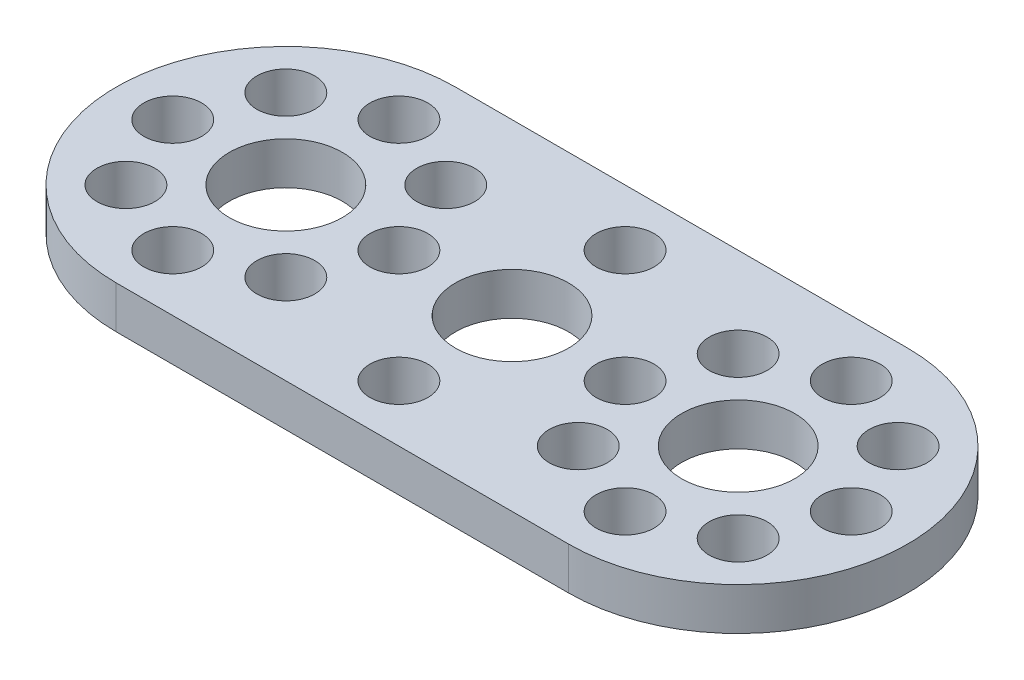
ISO-10303-21;
HEADER;
FILE_DESCRIPTION(('STEP AP214'),'2;1');
FILE_NAME('part.step','',(''),(''),'','','');
FILE_SCHEMA(('AUTOMOTIVE_DESIGN { 1 0 10303 214 1 1 1 1 }'));
ENDSEC;
DATA;
#1=APPLICATION_CONTEXT('core data for automotive mechanical design processes');
#2=APPLICATION_PROTOCOL_DEFINITION('international standard','automotive_design',2000,#1);
#3=PRODUCT_CONTEXT('',#1,'mechanical');
#4=PRODUCT('Part','Part','',(#3));
#5=PRODUCT_RELATED_PRODUCT_CATEGORY('part','',(#4));
#6=PRODUCT_DEFINITION_FORMATION('','',#4);
#7=PRODUCT_DEFINITION_CONTEXT('part definition',#1,'design');
#8=PRODUCT_DEFINITION('design','',#6,#7);
#9=PRODUCT_DEFINITION_SHAPE('','',#8);
#10=(LENGTH_UNIT() NAMED_UNIT(*) SI_UNIT(.MILLI.,.METRE.));
#11=(NAMED_UNIT(*) PLANE_ANGLE_UNIT() SI_UNIT($,.RADIAN.));
#12=(NAMED_UNIT(*) SI_UNIT($,.STERADIAN.) SOLID_ANGLE_UNIT());
#13=UNCERTAINTY_MEASURE_WITH_UNIT(LENGTH_MEASURE(1.E-05),#10,'distance_accuracy_value','');
#14=(GEOMETRIC_REPRESENTATION_CONTEXT(3) GLOBAL_UNCERTAINTY_ASSIGNED_CONTEXT((#13)) GLOBAL_UNIT_ASSIGNED_CONTEXT((#10,
#11,#12)) REPRESENTATION_CONTEXT('',''));
#15=CARTESIAN_POINT('',(0.,0.,0.));
#16=DIRECTION('',(0.,0.,1.));
#17=DIRECTION('',(1.,0.,0.));
#18=AXIS2_PLACEMENT_3D('',#15,#16,#17);
#19=CARTESIAN_POINT('',(0.,3.,0.));
#20=DIRECTION('',(0.,-1.,0.));
#21=DIRECTION('',(0.,0.,-1.));
#22=AXIS2_PLACEMENT_3D('',#19,#20,#21);
#23=CYLINDRICAL_SURFACE('',#22,12.);
#24=CARTESIAN_POINT('',(0.,0.,0.));
#25=DIRECTION('',(0.,1.,0.));
#26=DIRECTION('',(0.,0.,1.));
#27=AXIS2_PLACEMENT_3D('',#24,#25,#26);
#28=CIRCLE('',#27,12.);
#29=CARTESIAN_POINT('',(0.,0.,-12.));
#30=VERTEX_POINT('',#29);
#31=CARTESIAN_POINT('',(0.,0.,12.));
#32=VERTEX_POINT('',#31);
#33=EDGE_CURVE('E96',#30,#32,#28,.T.);
#34=ORIENTED_EDGE('',*,*,#33,.T.);
#35=DIRECTION('',(0.,-1.,0.));
#36=VECTOR('',#35,1.);
#37=CARTESIAN_POINT('',(0.,3.,12.));
#38=LINE('',#37,#36);
#39=CARTESIAN_POINT('',(0.,3.,12.));
#40=VERTEX_POINT('',#39);
#41=EDGE_CURVE('E11',#40,#32,#38,.T.);
#42=ORIENTED_EDGE('',*,*,#41,.F.);
#43=CARTESIAN_POINT('',(0.,3.,0.));
#44=DIRECTION('',(0.,1.,0.));
#45=DIRECTION('',(0.,0.,1.));
#46=AXIS2_PLACEMENT_3D('',#43,#44,#45);
#47=CIRCLE('',#46,12.);
#48=CARTESIAN_POINT('',(0.,3.,-12.));
#49=VERTEX_POINT('',#48);
#50=EDGE_CURVE('E84',#49,#40,#47,.T.);
#51=ORIENTED_EDGE('',*,*,#50,.F.);
#52=DIRECTION('',(0.,-1.,0.));
#53=VECTOR('',#52,1.);
#54=CARTESIAN_POINT('',(0.,3.,-12.));
#55=LINE('',#54,#53);
#56=EDGE_CURVE('E92',#49,#30,#55,.T.);
#57=ORIENTED_EDGE('',*,*,#56,.T.);
#58=EDGE_LOOP('',(#34,#42,#51,#57));
#59=FACE_BOUND('',#58,.T.);
#60=ADVANCED_FACE('F33',(#59),#23,.T.);
#61=CARTESIAN_POINT('',(0.,3.,12.));
#62=DIRECTION('',(0.,0.,-1.));
#63=DIRECTION('',(-1.,0.,0.));
#64=AXIS2_PLACEMENT_3D('',#61,#62,#63);
#65=PLANE('',#64);
#66=DIRECTION('',(1.,0.,0.));
#67=VECTOR('',#66,1.);
#68=CARTESIAN_POINT('',(0.,0.,12.));
#69=LINE('',#68,#67);
#70=CARTESIAN_POINT('',(32.,0.,12.));
#71=VERTEX_POINT('',#70);
#72=EDGE_CURVE('E88',#32,#71,#69,.T.);
#73=ORIENTED_EDGE('',*,*,#72,.T.);
#74=DIRECTION('',(0.,-1.,0.));
#75=VECTOR('',#74,1.);
#76=CARTESIAN_POINT('',(32.,3.,12.));
#77=LINE('',#76,#75);
#78=CARTESIAN_POINT('',(32.,3.,12.));
#79=VERTEX_POINT('',#78);
#80=EDGE_CURVE('E41',#79,#71,#77,.T.);
#81=ORIENTED_EDGE('',*,*,#80,.F.);
#82=DIRECTION('',(1.,0.,0.));
#83=VECTOR('',#82,1.);
#84=CARTESIAN_POINT('',(0.,3.,12.));
#85=LINE('',#84,#83);
#86=EDGE_CURVE('E79',#40,#79,#85,.T.);
#87=ORIENTED_EDGE('',*,*,#86,.F.);
#88=ORIENTED_EDGE('',*,*,#41,.T.);
#89=EDGE_LOOP('',(#73,#81,#87,#88));
#90=FACE_BOUND('',#89,.T.);
#91=ADVANCED_FACE('F87',(#90),#65,.F.);
#92=CARTESIAN_POINT('',(32.,3.,0.));
#93=DIRECTION('',(0.,-1.,0.));
#94=DIRECTION('',(0.,0.,-1.));
#95=AXIS2_PLACEMENT_3D('',#92,#93,#94);
#96=CYLINDRICAL_SURFACE('',#95,12.);
#97=CARTESIAN_POINT('',(32.,0.,0.));
#98=DIRECTION('',(0.,1.,0.));
#99=DIRECTION('',(0.,0.,1.));
#100=AXIS2_PLACEMENT_3D('',#97,#98,#99);
#101=CIRCLE('',#100,12.);
#102=CARTESIAN_POINT('',(32.,0.,-12.));
#103=VERTEX_POINT('',#102);
#104=EDGE_CURVE('E66',#71,#103,#101,.T.);
#105=ORIENTED_EDGE('',*,*,#104,.T.);
#106=DIRECTION('',(0.,-1.,0.));
#107=VECTOR('',#106,1.);
#108=CARTESIAN_POINT('',(32.,3.,-12.));
#109=LINE('',#108,#107);
#110=CARTESIAN_POINT('',(32.,3.,-12.));
#111=VERTEX_POINT('',#110);
#112=EDGE_CURVE('E89',#111,#103,#109,.T.);
#113=ORIENTED_EDGE('',*,*,#112,.F.);
#114=CARTESIAN_POINT('',(32.,3.,0.));
#115=DIRECTION('',(0.,1.,0.));
#116=DIRECTION('',(0.,0.,1.));
#117=AXIS2_PLACEMENT_3D('',#114,#115,#116);
#118=CIRCLE('',#117,12.);
#119=EDGE_CURVE('E82',#79,#111,#118,.T.);
#120=ORIENTED_EDGE('',*,*,#119,.F.);
#121=ORIENTED_EDGE('',*,*,#80,.T.);
#122=EDGE_LOOP('',(#105,#113,#120,#121));
#123=FACE_BOUND('',#122,.T.);
#124=ADVANCED_FACE('F90',(#123),#96,.T.);
#125=CARTESIAN_POINT('',(0.,3.,-12.));
#126=DIRECTION('',(0.,0.,1.));
#127=DIRECTION('',(1.,0.,0.));
#128=AXIS2_PLACEMENT_3D('',#125,#126,#127);
#129=PLANE('',#128);
#130=DIRECTION('',(-1.,0.,0.));
#131=VECTOR('',#130,1.);
#132=CARTESIAN_POINT('',(0.,0.,-12.));
#133=LINE('',#132,#131);
#134=EDGE_CURVE('E72',#103,#30,#133,.T.);
#135=ORIENTED_EDGE('',*,*,#134,.T.);
#136=ORIENTED_EDGE('',*,*,#56,.F.);
#137=DIRECTION('',(-1.,0.,0.));
#138=VECTOR('',#137,1.);
#139=CARTESIAN_POINT('',(0.,3.,-12.));
#140=LINE('',#139,#138);
#141=EDGE_CURVE('E49',#111,#49,#140,.T.);
#142=ORIENTED_EDGE('',*,*,#141,.F.);
#143=ORIENTED_EDGE('',*,*,#112,.T.);
#144=EDGE_LOOP('',(#135,#136,#142,#143));
#145=FACE_BOUND('',#144,.T.);
#146=ADVANCED_FACE('F104',(#145),#129,.F.);
#147=CARTESIAN_POINT('',(0.,3.,0.));
#148=DIRECTION('',(0.,1.,0.));
#149=DIRECTION('',(0.,0.,1.));
#150=AXIS2_PLACEMENT_3D('',#147,#148,#149);
#151=PLANE('',#150);
#152=CARTESIAN_POINT('',(32.,3.,7.99999999999999));
#153=DIRECTION('',(0.,1.,0.));
#154=DIRECTION('',(0.,0.,-1.));
#155=AXIS2_PLACEMENT_3D('',#152,#153,#154);
#156=CIRCLE('',#155,2.04999999999999);
#157=CARTESIAN_POINT('',(32.,3.,5.94999999999999));
#158=VERTEX_POINT('',#157);
#159=EDGE_CURVE('E201',#158,#158,#156,.T.);
#160=ORIENTED_EDGE('',*,*,#159,.F.);
#161=EDGE_LOOP('',(#160));
#162=FACE_BOUND('',#161,.T.);
#163=CARTESIAN_POINT('',(37.6568542494924,3.,5.65685424949237));
#164=DIRECTION('',(0.,1.,0.));
#165=DIRECTION('',(0.,0.,-1.));
#166=AXIS2_PLACEMENT_3D('',#163,#164,#165);
#167=CIRCLE('',#166,2.05);
#168=CARTESIAN_POINT('',(37.6568542494924,3.,3.60685424949237));
#169=VERTEX_POINT('',#168);
#170=EDGE_CURVE('E195',#169,#169,#167,.T.);
#171=ORIENTED_EDGE('',*,*,#170,.F.);
#172=EDGE_LOOP('',(#171));
#173=FACE_BOUND('',#172,.T.);
#174=CARTESIAN_POINT('',(40.,3.,0.));
#175=DIRECTION('',(0.,1.,0.));
#176=DIRECTION('',(0.,0.,-1.));
#177=AXIS2_PLACEMENT_3D('',#174,#175,#176);
#178=CIRCLE('',#177,2.05);
#179=CARTESIAN_POINT('',(40.,3.,-2.05000000000001));
#180=VERTEX_POINT('',#179);
#181=EDGE_CURVE('E189',#180,#180,#178,.T.);
#182=ORIENTED_EDGE('',*,*,#181,.F.);
#183=EDGE_LOOP('',(#182));
#184=FACE_BOUND('',#183,.T.);
#185=CARTESIAN_POINT('',(37.6568542494924,3.,-5.65685424949238));
#186=DIRECTION('',(0.,1.,0.));
#187=DIRECTION('',(0.,0.,-1.));
#188=AXIS2_PLACEMENT_3D('',#185,#186,#187);
#189=CIRCLE('',#188,2.05);
#190=CARTESIAN_POINT('',(37.6568542494924,3.,-7.70685424949238));
#191=VERTEX_POINT('',#190);
#192=EDGE_CURVE('E182',#191,#191,#189,.T.);
#193=ORIENTED_EDGE('',*,*,#192,.F.);
#194=EDGE_LOOP('',(#193));
#195=FACE_BOUND('',#194,.T.);
#196=CARTESIAN_POINT('',(16.,3.,8.));
#197=DIRECTION('',(0.,1.,0.));
#198=DIRECTION('',(0.,0.,1.));
#199=AXIS2_PLACEMENT_3D('',#196,#197,#198);
#200=CIRCLE('',#199,2.05);
#201=CARTESIAN_POINT('',(16.,3.,10.05));
#202=VERTEX_POINT('',#201);
#203=EDGE_CURVE('E218',#202,#202,#200,.T.);
#204=ORIENTED_EDGE('',*,*,#203,.F.);
#205=EDGE_LOOP('',(#204));
#206=FACE_BOUND('',#205,.T.);
#207=CARTESIAN_POINT('',(16.,3.,-8.));
#208=DIRECTION('',(0.,1.,0.));
#209=DIRECTION('',(0.,0.,1.));
#210=AXIS2_PLACEMENT_3D('',#207,#208,#209);
#211=CIRCLE('',#210,2.05);
#212=CARTESIAN_POINT('',(16.,3.,-5.95));
#213=VERTEX_POINT('',#212);
#214=EDGE_CURVE('E224',#213,#213,#211,.T.);
#215=ORIENTED_EDGE('',*,*,#214,.F.);
#216=EDGE_LOOP('',(#215));
#217=FACE_BOUND('',#216,.T.);
#218=CARTESIAN_POINT('',(24.,3.,0.));
#219=DIRECTION('',(0.,1.,0.));
#220=DIRECTION('',(0.,0.,-1.));
#221=AXIS2_PLACEMENT_3D('',#218,#219,#220);
#222=CIRCLE('',#221,2.05);
#223=CARTESIAN_POINT('',(24.,3.,-2.05000000000001));
#224=VERTEX_POINT('',#223);
#225=EDGE_CURVE('E230',#224,#224,#222,.T.);
#226=ORIENTED_EDGE('',*,*,#225,.F.);
#227=EDGE_LOOP('',(#226));
#228=FACE_BOUND('',#227,.T.);
#229=CARTESIAN_POINT('',(26.3431457505076,3.,-5.65685424949238));
#230=DIRECTION('',(0.,1.,0.));
#231=DIRECTION('',(0.,0.,-1.));
#232=AXIS2_PLACEMENT_3D('',#229,#230,#231);
#233=CIRCLE('',#232,2.05);
#234=CARTESIAN_POINT('',(26.3431457505076,3.,-7.70685424949238));
#235=VERTEX_POINT('',#234);
#236=EDGE_CURVE('E206',#235,#235,#233,.T.);
#237=ORIENTED_EDGE('',*,*,#236,.F.);
#238=EDGE_LOOP('',(#237));
#239=FACE_BOUND('',#238,.T.);
#240=CARTESIAN_POINT('',(32.,3.,-8.));
#241=DIRECTION('',(0.,1.,0.));
#242=DIRECTION('',(0.,0.,-1.));
#243=AXIS2_PLACEMENT_3D('',#240,#241,#242);
#244=CIRCLE('',#243,2.04999999999999);
#245=CARTESIAN_POINT('',(32.,3.,-10.05));
#246=VERTEX_POINT('',#245);
#247=EDGE_CURVE('E213',#246,#246,#244,.T.);
#248=ORIENTED_EDGE('',*,*,#247,.F.);
#249=EDGE_LOOP('',(#248));
#250=FACE_BOUND('',#249,.T.);
#251=CARTESIAN_POINT('',(-5.65685424949238,3.,-5.65685424949238));
#252=DIRECTION('',(0.,1.,0.));
#253=DIRECTION('',(0.,0.,1.));
#254=AXIS2_PLACEMENT_3D('',#251,#252,#253);
#255=CIRCLE('',#254,2.05);
#256=CARTESIAN_POINT('',(-5.65685424949238,3.,-3.60685424949238));
#257=VERTEX_POINT('',#256);
#258=EDGE_CURVE('E134',#257,#257,#255,.T.);
#259=ORIENTED_EDGE('',*,*,#258,.F.);
#260=EDGE_LOOP('',(#259));
#261=FACE_BOUND('',#260,.T.);
#262=CARTESIAN_POINT('',(-8.,3.,0.));
#263=DIRECTION('',(0.,1.,0.));
#264=DIRECTION('',(0.,0.,1.));
#265=AXIS2_PLACEMENT_3D('',#262,#263,#264);
#266=CIRCLE('',#265,2.05);
#267=CARTESIAN_POINT('',(-8.,3.,2.05));
#268=VERTEX_POINT('',#267);
#269=EDGE_CURVE('E141',#268,#268,#266,.T.);
#270=ORIENTED_EDGE('',*,*,#269,.F.);
#271=EDGE_LOOP('',(#270));
#272=FACE_BOUND('',#271,.T.);
#273=CARTESIAN_POINT('',(-5.65685424949238,3.,5.65685424949238));
#274=DIRECTION('',(0.,1.,0.));
#275=DIRECTION('',(0.,0.,1.));
#276=AXIS2_PLACEMENT_3D('',#273,#274,#275);
#277=CIRCLE('',#276,2.05);
#278=CARTESIAN_POINT('',(-5.65685424949238,3.,7.70685424949238));
#279=VERTEX_POINT('',#278);
#280=EDGE_CURVE('E147',#279,#279,#277,.T.);
#281=ORIENTED_EDGE('',*,*,#280,.F.);
#282=EDGE_LOOP('',(#281));
#283=FACE_BOUND('',#282,.T.);
#284=CARTESIAN_POINT('',(0.,3.,8.));
#285=DIRECTION('',(0.,1.,0.));
#286=DIRECTION('',(0.,0.,1.));
#287=AXIS2_PLACEMENT_3D('',#284,#285,#286);
#288=CIRCLE('',#287,2.05);
#289=CARTESIAN_POINT('',(0.,3.,10.05));
#290=VERTEX_POINT('',#289);
#291=EDGE_CURVE('E153',#290,#290,#288,.T.);
#292=ORIENTED_EDGE('',*,*,#291,.F.);
#293=EDGE_LOOP('',(#292));
#294=FACE_BOUND('',#293,.T.);
#295=CARTESIAN_POINT('',(26.3431457505076,3.,5.65685424949237));
#296=DIRECTION('',(0.,1.,0.));
#297=DIRECTION('',(0.,0.,-1.));
#298=AXIS2_PLACEMENT_3D('',#295,#296,#297);
#299=CIRCLE('',#298,2.05);
#300=CARTESIAN_POINT('',(26.3431457505076,3.,3.60685424949237));
#301=VERTEX_POINT('',#300);
#302=EDGE_CURVE('E167',#301,#301,#299,.T.);
#303=ORIENTED_EDGE('',*,*,#302,.F.);
#304=EDGE_LOOP('',(#303));
#305=FACE_BOUND('',#304,.T.);
#306=CARTESIAN_POINT('',(5.65685424949238,3.,-5.65685424949238));
#307=DIRECTION('',(0.,1.,0.));
#308=DIRECTION('',(0.,0.,1.));
#309=AXIS2_PLACEMENT_3D('',#306,#307,#308);
#310=CIRCLE('',#309,2.05);
#311=CARTESIAN_POINT('',(5.65685424949238,3.,-3.60685424949238));
#312=VERTEX_POINT('',#311);
#313=EDGE_CURVE('E160',#312,#312,#310,.T.);
#314=ORIENTED_EDGE('',*,*,#313,.F.);
#315=EDGE_LOOP('',(#314));
#316=FACE_BOUND('',#315,.T.);
#317=CARTESIAN_POINT('',(8.,3.,0.));
#318=DIRECTION('',(0.,1.,0.));
#319=DIRECTION('',(0.,0.,1.));
#320=AXIS2_PLACEMENT_3D('',#317,#318,#319);
#321=CIRCLE('',#320,2.05);
#322=CARTESIAN_POINT('',(8.,3.,2.05));
#323=VERTEX_POINT('',#322);
#324=EDGE_CURVE('E177',#323,#323,#321,.T.);
#325=ORIENTED_EDGE('',*,*,#324,.F.);
#326=EDGE_LOOP('',(#325));
#327=FACE_BOUND('',#326,.T.);
#328=CARTESIAN_POINT('',(5.65685424949238,3.,5.65685424949238));
#329=DIRECTION('',(0.,1.,0.));
#330=DIRECTION('',(0.,0.,1.));
#331=AXIS2_PLACEMENT_3D('',#328,#329,#330);
#332=CIRCLE('',#331,2.05);
#333=CARTESIAN_POINT('',(5.65685424949238,3.,7.70685424949238));
#334=VERTEX_POINT('',#333);
#335=EDGE_CURVE('E159',#334,#334,#332,.T.);
#336=ORIENTED_EDGE('',*,*,#335,.F.);
#337=EDGE_LOOP('',(#336));
#338=FACE_BOUND('',#337,.T.);
#339=CARTESIAN_POINT('',(0.,3.,-8.));
#340=DIRECTION('',(0.,1.,0.));
#341=DIRECTION('',(0.,0.,1.));
#342=AXIS2_PLACEMENT_3D('',#339,#340,#341);
#343=CIRCLE('',#342,2.05);
#344=CARTESIAN_POINT('',(0.,3.,-5.95));
#345=VERTEX_POINT('',#344);
#346=EDGE_CURVE('E128',#345,#345,#343,.T.);
#347=ORIENTED_EDGE('',*,*,#346,.F.);
#348=EDGE_LOOP('',(#347));
#349=FACE_BOUND('',#348,.T.);
#350=CARTESIAN_POINT('',(16.,3.,0.));
#351=DIRECTION('',(0.,1.,0.));
#352=DIRECTION('',(0.,0.,1.));
#353=AXIS2_PLACEMENT_3D('',#350,#351,#352);
#354=CIRCLE('',#353,4.);
#355=CARTESIAN_POINT('',(16.,3.,4.));
#356=VERTEX_POINT('',#355);
#357=EDGE_CURVE('E123',#356,#356,#354,.T.);
#358=ORIENTED_EDGE('',*,*,#357,.F.);
#359=EDGE_LOOP('',(#358));
#360=FACE_BOUND('',#359,.T.);
#361=CARTESIAN_POINT('',(32.,3.,0.));
#362=DIRECTION('',(0.,1.,0.));
#363=DIRECTION('',(0.,0.,1.));
#364=AXIS2_PLACEMENT_3D('',#361,#362,#363);
#365=CIRCLE('',#364,4.00000000000001);
#366=CARTESIAN_POINT('',(32.,3.,4.00000000000001));
#367=VERTEX_POINT('',#366);
#368=EDGE_CURVE('E116',#367,#367,#365,.T.);
#369=ORIENTED_EDGE('',*,*,#368,.F.);
#370=EDGE_LOOP('',(#369));
#371=FACE_BOUND('',#370,.T.);
#372=CARTESIAN_POINT('',(0.,3.,0.));
#373=DIRECTION('',(0.,1.,0.));
#374=DIRECTION('',(0.,0.,1.));
#375=AXIS2_PLACEMENT_3D('',#372,#373,#374);
#376=CIRCLE('',#375,4.);
#377=CARTESIAN_POINT('',(0.,3.,4.));
#378=VERTEX_POINT('',#377);
#379=EDGE_CURVE('E110',#378,#378,#376,.T.);
#380=ORIENTED_EDGE('',*,*,#379,.F.);
#381=EDGE_LOOP('',(#380));
#382=FACE_BOUND('',#381,.T.);
#383=ORIENTED_EDGE('',*,*,#50,.T.);
#384=ORIENTED_EDGE('',*,*,#86,.T.);
#385=ORIENTED_EDGE('',*,*,#119,.T.);
#386=ORIENTED_EDGE('',*,*,#141,.T.);
#387=EDGE_LOOP('',(#383,#384,#385,#386));
#388=FACE_BOUND('',#387,.T.);
#389=ADVANCED_FACE('F80',(#162,#173,#184,#195,#206,#217,#228,#239,#250,#261,#272,#283,#294,#305,
#316,#327,#338,#349,#360,#371,#382,#388),#151,.T.);
#390=CARTESIAN_POINT('',(0.,0.,0.));
#391=DIRECTION('',(0.,1.,0.));
#392=DIRECTION('',(0.,0.,1.));
#393=AXIS2_PLACEMENT_3D('',#390,#391,#392);
#394=PLANE('',#393);
#395=CARTESIAN_POINT('',(32.,0.,7.99999999999999));
#396=DIRECTION('',(0.,1.,0.));
#397=DIRECTION('',(0.,0.,-1.));
#398=AXIS2_PLACEMENT_3D('',#395,#396,#397);
#399=CIRCLE('',#398,2.04999999999999);
#400=CARTESIAN_POINT('',(32.,0.,5.94999999999999));
#401=VERTEX_POINT('',#400);
#402=EDGE_CURVE('E138',#401,#401,#399,.T.);
#403=ORIENTED_EDGE('',*,*,#402,.T.);
#404=EDGE_LOOP('',(#403));
#405=FACE_BOUND('',#404,.T.);
#406=CARTESIAN_POINT('',(37.6568542494924,0.,5.65685424949237));
#407=DIRECTION('',(0.,1.,0.));
#408=DIRECTION('',(0.,0.,-1.));
#409=AXIS2_PLACEMENT_3D('',#406,#407,#408);
#410=CIRCLE('',#409,2.05);
#411=CARTESIAN_POINT('',(37.6568542494924,0.,3.60685424949237));
#412=VERTEX_POINT('',#411);
#413=EDGE_CURVE('E198',#412,#412,#410,.T.);
#414=ORIENTED_EDGE('',*,*,#413,.T.);
#415=EDGE_LOOP('',(#414));
#416=FACE_BOUND('',#415,.T.);
#417=CARTESIAN_POINT('',(40.,0.,0.));
#418=DIRECTION('',(0.,1.,0.));
#419=DIRECTION('',(0.,0.,-1.));
#420=AXIS2_PLACEMENT_3D('',#417,#418,#419);
#421=CIRCLE('',#420,2.05);
#422=CARTESIAN_POINT('',(40.,0.,-2.05000000000001));
#423=VERTEX_POINT('',#422);
#424=EDGE_CURVE('E192',#423,#423,#421,.T.);
#425=ORIENTED_EDGE('',*,*,#424,.T.);
#426=EDGE_LOOP('',(#425));
#427=FACE_BOUND('',#426,.T.);
#428=CARTESIAN_POINT('',(37.6568542494924,0.,-5.65685424949238));
#429=DIRECTION('',(0.,1.,0.));
#430=DIRECTION('',(0.,0.,-1.));
#431=AXIS2_PLACEMENT_3D('',#428,#429,#430);
#432=CIRCLE('',#431,2.05);
#433=CARTESIAN_POINT('',(37.6568542494924,0.,-7.70685424949238));
#434=VERTEX_POINT('',#433);
#435=EDGE_CURVE('E185',#434,#434,#432,.T.);
#436=ORIENTED_EDGE('',*,*,#435,.T.);
#437=EDGE_LOOP('',(#436));
#438=FACE_BOUND('',#437,.T.);
#439=CARTESIAN_POINT('',(16.,0.,8.));
#440=DIRECTION('',(0.,1.,0.));
#441=DIRECTION('',(0.,0.,1.));
#442=AXIS2_PLACEMENT_3D('',#439,#440,#441);
#443=CIRCLE('',#442,2.05);
#444=CARTESIAN_POINT('',(16.,0.,10.05));
#445=VERTEX_POINT('',#444);
#446=EDGE_CURVE('E221',#445,#445,#443,.T.);
#447=ORIENTED_EDGE('',*,*,#446,.T.);
#448=EDGE_LOOP('',(#447));
#449=FACE_BOUND('',#448,.T.);
#450=CARTESIAN_POINT('',(16.,0.,-8.));
#451=DIRECTION('',(0.,1.,0.));
#452=DIRECTION('',(0.,0.,1.));
#453=AXIS2_PLACEMENT_3D('',#450,#451,#452);
#454=CIRCLE('',#453,2.05);
#455=CARTESIAN_POINT('',(16.,0.,-5.95));
#456=VERTEX_POINT('',#455);
#457=EDGE_CURVE('E227',#456,#456,#454,.T.);
#458=ORIENTED_EDGE('',*,*,#457,.T.);
#459=EDGE_LOOP('',(#458));
#460=FACE_BOUND('',#459,.T.);
#461=CARTESIAN_POINT('',(24.,0.,0.));
#462=DIRECTION('',(0.,1.,0.));
#463=DIRECTION('',(0.,0.,-1.));
#464=AXIS2_PLACEMENT_3D('',#461,#462,#463);
#465=CIRCLE('',#464,2.05);
#466=CARTESIAN_POINT('',(24.,0.,-2.05000000000001));
#467=VERTEX_POINT('',#466);
#468=EDGE_CURVE('E210',#467,#467,#465,.T.);
#469=ORIENTED_EDGE('',*,*,#468,.T.);
#470=EDGE_LOOP('',(#469));
#471=FACE_BOUND('',#470,.T.);
#472=CARTESIAN_POINT('',(26.3431457505076,0.,-5.65685424949238));
#473=DIRECTION('',(0.,1.,0.));
#474=DIRECTION('',(0.,0.,-1.));
#475=AXIS2_PLACEMENT_3D('',#472,#473,#474);
#476=CIRCLE('',#475,2.05);
#477=CARTESIAN_POINT('',(26.3431457505076,0.,-7.70685424949238));
#478=VERTEX_POINT('',#477);
#479=EDGE_CURVE('E209',#478,#478,#476,.T.);
#480=ORIENTED_EDGE('',*,*,#479,.T.);
#481=EDGE_LOOP('',(#480));
#482=FACE_BOUND('',#481,.T.);
#483=CARTESIAN_POINT('',(32.,0.,-8.));
#484=DIRECTION('',(0.,1.,0.));
#485=DIRECTION('',(0.,0.,-1.));
#486=AXIS2_PLACEMENT_3D('',#483,#484,#485);
#487=CIRCLE('',#486,2.04999999999999);
#488=CARTESIAN_POINT('',(32.,0.,-10.05));
#489=VERTEX_POINT('',#488);
#490=EDGE_CURVE('E186',#489,#489,#487,.T.);
#491=ORIENTED_EDGE('',*,*,#490,.T.);
#492=EDGE_LOOP('',(#491));
#493=FACE_BOUND('',#492,.T.);
#494=CARTESIAN_POINT('',(-5.65685424949238,0.,-5.65685424949238));
#495=DIRECTION('',(0.,1.,0.));
#496=DIRECTION('',(0.,0.,1.));
#497=AXIS2_PLACEMENT_3D('',#494,#495,#496);
#498=CIRCLE('',#497,2.05);
#499=CARTESIAN_POINT('',(-5.65685424949238,0.,-3.60685424949238));
#500=VERTEX_POINT('',#499);
#501=EDGE_CURVE('E137',#500,#500,#498,.T.);
#502=ORIENTED_EDGE('',*,*,#501,.T.);
#503=EDGE_LOOP('',(#502));
#504=FACE_BOUND('',#503,.T.);
#505=CARTESIAN_POINT('',(-8.,0.,0.));
#506=DIRECTION('',(0.,1.,0.));
#507=DIRECTION('',(0.,0.,1.));
#508=AXIS2_PLACEMENT_3D('',#505,#506,#507);
#509=CIRCLE('',#508,2.05);
#510=CARTESIAN_POINT('',(-8.,0.,2.05));
#511=VERTEX_POINT('',#510);
#512=EDGE_CURVE('E144',#511,#511,#509,.T.);
#513=ORIENTED_EDGE('',*,*,#512,.T.);
#514=EDGE_LOOP('',(#513));
#515=FACE_BOUND('',#514,.T.);
#516=CARTESIAN_POINT('',(-5.65685424949238,0.,5.65685424949238));
#517=DIRECTION('',(0.,1.,0.));
#518=DIRECTION('',(0.,0.,1.));
#519=AXIS2_PLACEMENT_3D('',#516,#517,#518);
#520=CIRCLE('',#519,2.05);
#521=CARTESIAN_POINT('',(-5.65685424949238,0.,7.70685424949238));
#522=VERTEX_POINT('',#521);
#523=EDGE_CURVE('E150',#522,#522,#520,.T.);
#524=ORIENTED_EDGE('',*,*,#523,.T.);
#525=EDGE_LOOP('',(#524));
#526=FACE_BOUND('',#525,.T.);
#527=CARTESIAN_POINT('',(0.,0.,8.));
#528=DIRECTION('',(0.,1.,0.));
#529=DIRECTION('',(0.,0.,1.));
#530=AXIS2_PLACEMENT_3D('',#527,#528,#529);
#531=CIRCLE('',#530,2.05);
#532=CARTESIAN_POINT('',(0.,0.,10.05));
#533=VERTEX_POINT('',#532);
#534=EDGE_CURVE('E156',#533,#533,#531,.T.);
#535=ORIENTED_EDGE('',*,*,#534,.T.);
#536=EDGE_LOOP('',(#535));
#537=FACE_BOUND('',#536,.T.);
#538=CARTESIAN_POINT('',(26.3431457505076,0.,5.65685424949237));
#539=DIRECTION('',(0.,1.,0.));
#540=DIRECTION('',(0.,0.,-1.));
#541=AXIS2_PLACEMENT_3D('',#538,#539,#540);
#542=CIRCLE('',#541,2.05);
#543=CARTESIAN_POINT('',(26.3431457505076,0.,3.60685424949237));
#544=VERTEX_POINT('',#543);
#545=EDGE_CURVE('E131',#544,#544,#542,.T.);
#546=ORIENTED_EDGE('',*,*,#545,.T.);
#547=EDGE_LOOP('',(#546));
#548=FACE_BOUND('',#547,.T.);
#549=CARTESIAN_POINT('',(5.65685424949238,0.,-5.65685424949238));
#550=DIRECTION('',(0.,1.,0.));
#551=DIRECTION('',(0.,0.,1.));
#552=AXIS2_PLACEMENT_3D('',#549,#550,#551);
#553=CIRCLE('',#552,2.05);
#554=CARTESIAN_POINT('',(5.65685424949238,0.,-3.60685424949238));
#555=VERTEX_POINT('',#554);
#556=EDGE_CURVE('E163',#555,#555,#553,.T.);
#557=ORIENTED_EDGE('',*,*,#556,.T.);
#558=EDGE_LOOP('',(#557));
#559=FACE_BOUND('',#558,.T.);
#560=CARTESIAN_POINT('',(8.,0.,0.));
#561=DIRECTION('',(0.,1.,0.));
#562=DIRECTION('',(0.,0.,1.));
#563=AXIS2_PLACEMENT_3D('',#560,#561,#562);
#564=CIRCLE('',#563,2.05);
#565=CARTESIAN_POINT('',(8.,0.,2.05));
#566=VERTEX_POINT('',#565);
#567=EDGE_CURVE('E164',#566,#566,#564,.T.);
#568=ORIENTED_EDGE('',*,*,#567,.T.);
#569=EDGE_LOOP('',(#568));
#570=FACE_BOUND('',#569,.T.);
#571=CARTESIAN_POINT('',(5.65685424949238,0.,5.65685424949238));
#572=DIRECTION('',(0.,1.,0.));
#573=DIRECTION('',(0.,0.,1.));
#574=AXIS2_PLACEMENT_3D('',#571,#572,#573);
#575=CIRCLE('',#574,2.05);
#576=CARTESIAN_POINT('',(5.65685424949238,0.,7.70685424949238));
#577=VERTEX_POINT('',#576);
#578=EDGE_CURVE('E174',#577,#577,#575,.T.);
#579=ORIENTED_EDGE('',*,*,#578,.T.);
#580=EDGE_LOOP('',(#579));
#581=FACE_BOUND('',#580,.T.);
#582=CARTESIAN_POINT('',(0.,0.,-8.));
#583=DIRECTION('',(0.,1.,0.));
#584=DIRECTION('',(0.,0.,1.));
#585=AXIS2_PLACEMENT_3D('',#582,#583,#584);
#586=CIRCLE('',#585,2.05);
#587=CARTESIAN_POINT('',(0.,0.,-5.95));
#588=VERTEX_POINT('',#587);
#589=EDGE_CURVE('E120',#588,#588,#586,.T.);
#590=ORIENTED_EDGE('',*,*,#589,.T.);
#591=EDGE_LOOP('',(#590));
#592=FACE_BOUND('',#591,.T.);
#593=CARTESIAN_POINT('',(16.,0.,0.));
#594=DIRECTION('',(0.,1.,0.));
#595=DIRECTION('',(0.,0.,1.));
#596=AXIS2_PLACEMENT_3D('',#593,#594,#595);
#597=CIRCLE('',#596,4.);
#598=CARTESIAN_POINT('',(16.,0.,4.));
#599=VERTEX_POINT('',#598);
#600=EDGE_CURVE('E113',#599,#599,#597,.T.);
#601=ORIENTED_EDGE('',*,*,#600,.T.);
#602=EDGE_LOOP('',(#601));
#603=FACE_BOUND('',#602,.T.);
#604=CARTESIAN_POINT('',(32.,0.,0.));
#605=DIRECTION('',(0.,1.,0.));
#606=DIRECTION('',(0.,0.,1.));
#607=AXIS2_PLACEMENT_3D('',#604,#605,#606);
#608=CIRCLE('',#607,4.00000000000001);
#609=CARTESIAN_POINT('',(32.,0.,4.00000000000001));
#610=VERTEX_POINT('',#609);
#611=EDGE_CURVE('E119',#610,#610,#608,.T.);
#612=ORIENTED_EDGE('',*,*,#611,.T.);
#613=EDGE_LOOP('',(#612));
#614=FACE_BOUND('',#613,.T.);
#615=CARTESIAN_POINT('',(0.,0.,0.));
#616=DIRECTION('',(0.,1.,0.));
#617=DIRECTION('',(0.,0.,1.));
#618=AXIS2_PLACEMENT_3D('',#615,#616,#617);
#619=CIRCLE('',#618,4.);
#620=CARTESIAN_POINT('',(0.,0.,4.));
#621=VERTEX_POINT('',#620);
#622=EDGE_CURVE('E99',#621,#621,#619,.T.);
#623=ORIENTED_EDGE('',*,*,#622,.T.);
#624=EDGE_LOOP('',(#623));
#625=FACE_BOUND('',#624,.T.);
#626=ORIENTED_EDGE('',*,*,#33,.F.);
#627=ORIENTED_EDGE('',*,*,#134,.F.);
#628=ORIENTED_EDGE('',*,*,#104,.F.);
#629=ORIENTED_EDGE('',*,*,#72,.F.);
#630=EDGE_LOOP('',(#626,#627,#628,#629));
#631=FACE_BOUND('',#630,.T.);
#632=ADVANCED_FACE('F107',(#405,#416,#427,#438,#449,#460,#471,#482,#493,#504,#515,#526,#537,
#548,#559,#570,#581,#592,#603,#614,#625,#631),#394,.F.);
#633=CARTESIAN_POINT('',(0.,0.,0.));
#634=DIRECTION('',(0.,1.,0.));
#635=DIRECTION('',(0.,0.,1.));
#636=AXIS2_PLACEMENT_3D('',#633,#634,#635);
#637=CYLINDRICAL_SURFACE('',#636,4.);
#638=ORIENTED_EDGE('',*,*,#622,.F.);
#639=EDGE_LOOP('',(#638));
#640=FACE_BOUND('',#639,.T.);
#641=ORIENTED_EDGE('',*,*,#379,.T.);
#642=EDGE_LOOP('',(#641));
#643=FACE_BOUND('',#642,.T.);
#644=ADVANCED_FACE('F278',(#640,#643),#637,.F.);
#645=CARTESIAN_POINT('',(32.,0.,0.));
#646=DIRECTION('',(0.,1.,0.));
#647=DIRECTION('',(0.,0.,1.));
#648=AXIS2_PLACEMENT_3D('',#645,#646,#647);
#649=CYLINDRICAL_SURFACE('',#648,4.00000000000001);
#650=ORIENTED_EDGE('',*,*,#611,.F.);
#651=EDGE_LOOP('',(#650));
#652=FACE_BOUND('',#651,.T.);
#653=ORIENTED_EDGE('',*,*,#368,.T.);
#654=EDGE_LOOP('',(#653));
#655=FACE_BOUND('',#654,.T.);
#656=ADVANCED_FACE('F280',(#652,#655),#649,.F.);
#657=CARTESIAN_POINT('',(16.,0.,0.));
#658=DIRECTION('',(0.,1.,0.));
#659=DIRECTION('',(0.,0.,1.));
#660=AXIS2_PLACEMENT_3D('',#657,#658,#659);
#661=CYLINDRICAL_SURFACE('',#660,4.);
#662=ORIENTED_EDGE('',*,*,#600,.F.);
#663=EDGE_LOOP('',(#662));
#664=FACE_BOUND('',#663,.T.);
#665=ORIENTED_EDGE('',*,*,#357,.T.);
#666=EDGE_LOOP('',(#665));
#667=FACE_BOUND('',#666,.T.);
#668=ADVANCED_FACE('F287',(#664,#667),#661,.F.);
#669=CARTESIAN_POINT('',(0.,0.,-8.));
#670=DIRECTION('',(0.,1.,0.));
#671=DIRECTION('',(0.,0.,1.));
#672=AXIS2_PLACEMENT_3D('',#669,#670,#671);
#673=CYLINDRICAL_SURFACE('',#672,2.05);
#674=ORIENTED_EDGE('',*,*,#589,.F.);
#675=EDGE_LOOP('',(#674));
#676=FACE_BOUND('',#675,.T.);
#677=ORIENTED_EDGE('',*,*,#346,.T.);
#678=EDGE_LOOP('',(#677));
#679=FACE_BOUND('',#678,.T.);
#680=ADVANCED_FACE('F322',(#676,#679),#673,.F.);
#681=CARTESIAN_POINT('',(5.65685424949238,0.,5.65685424949238));
#682=DIRECTION('',(0.,1.,0.));
#683=DIRECTION('',(0.,0.,1.));
#684=AXIS2_PLACEMENT_3D('',#681,#682,#683);
#685=CYLINDRICAL_SURFACE('',#684,2.05);
#686=ORIENTED_EDGE('',*,*,#578,.F.);
#687=EDGE_LOOP('',(#686));
#688=FACE_BOUND('',#687,.T.);
#689=ORIENTED_EDGE('',*,*,#335,.T.);
#690=EDGE_LOOP('',(#689));
#691=FACE_BOUND('',#690,.T.);
#692=ADVANCED_FACE('F327',(#688,#691),#685,.F.);
#693=CARTESIAN_POINT('',(8.,0.,0.));
#694=DIRECTION('',(0.,1.,0.));
#695=DIRECTION('',(0.,0.,1.));
#696=AXIS2_PLACEMENT_3D('',#693,#694,#695);
#697=CYLINDRICAL_SURFACE('',#696,2.05);
#698=ORIENTED_EDGE('',*,*,#567,.F.);
#699=EDGE_LOOP('',(#698));
#700=FACE_BOUND('',#699,.T.);
#701=ORIENTED_EDGE('',*,*,#324,.T.);
#702=EDGE_LOOP('',(#701));
#703=FACE_BOUND('',#702,.T.);
#704=ADVANCED_FACE('F339',(#700,#703),#697,.F.);
#705=CARTESIAN_POINT('',(5.65685424949238,0.,-5.65685424949238));
#706=DIRECTION('',(0.,1.,0.));
#707=DIRECTION('',(0.,0.,1.));
#708=AXIS2_PLACEMENT_3D('',#705,#706,#707);
#709=CYLINDRICAL_SURFACE('',#708,2.05);
#710=ORIENTED_EDGE('',*,*,#556,.F.);
#711=EDGE_LOOP('',(#710));
#712=FACE_BOUND('',#711,.T.);
#713=ORIENTED_EDGE('',*,*,#313,.T.);
#714=EDGE_LOOP('',(#713));
#715=FACE_BOUND('',#714,.T.);
#716=ADVANCED_FACE('F349',(#712,#715),#709,.F.);
#717=CARTESIAN_POINT('',(26.3431457505076,0.,5.65685424949237));
#718=DIRECTION('',(0.,1.,0.));
#719=DIRECTION('',(0.,0.,1.));
#720=AXIS2_PLACEMENT_3D('',#717,#718,#719);
#721=CYLINDRICAL_SURFACE('',#720,2.05);
#722=ORIENTED_EDGE('',*,*,#545,.F.);
#723=EDGE_LOOP('',(#722));
#724=FACE_BOUND('',#723,.T.);
#725=ORIENTED_EDGE('',*,*,#302,.T.);
#726=EDGE_LOOP('',(#725));
#727=FACE_BOUND('',#726,.T.);
#728=ADVANCED_FACE('F359',(#724,#727),#721,.F.);
#729=CARTESIAN_POINT('',(0.,0.,8.));
#730=DIRECTION('',(0.,1.,0.));
#731=DIRECTION('',(0.,0.,1.));
#732=AXIS2_PLACEMENT_3D('',#729,#730,#731);
#733=CYLINDRICAL_SURFACE('',#732,2.05);
#734=ORIENTED_EDGE('',*,*,#534,.F.);
#735=EDGE_LOOP('',(#734));
#736=FACE_BOUND('',#735,.T.);
#737=ORIENTED_EDGE('',*,*,#291,.T.);
#738=EDGE_LOOP('',(#737));
#739=FACE_BOUND('',#738,.T.);
#740=ADVANCED_FACE('F369',(#736,#739),#733,.F.);
#741=CARTESIAN_POINT('',(-5.65685424949238,0.,5.65685424949238));
#742=DIRECTION('',(0.,1.,0.));
#743=DIRECTION('',(0.,0.,1.));
#744=AXIS2_PLACEMENT_3D('',#741,#742,#743);
#745=CYLINDRICAL_SURFACE('',#744,2.05);
#746=ORIENTED_EDGE('',*,*,#523,.F.);
#747=EDGE_LOOP('',(#746));
#748=FACE_BOUND('',#747,.T.);
#749=ORIENTED_EDGE('',*,*,#280,.T.);
#750=EDGE_LOOP('',(#749));
#751=FACE_BOUND('',#750,.T.);
#752=ADVANCED_FACE('F379',(#748,#751),#745,.F.);
#753=CARTESIAN_POINT('',(-8.,0.,0.));
#754=DIRECTION('',(0.,1.,0.));
#755=DIRECTION('',(0.,0.,1.));
#756=AXIS2_PLACEMENT_3D('',#753,#754,#755);
#757=CYLINDRICAL_SURFACE('',#756,2.05);
#758=ORIENTED_EDGE('',*,*,#512,.F.);
#759=EDGE_LOOP('',(#758));
#760=FACE_BOUND('',#759,.T.);
#761=ORIENTED_EDGE('',*,*,#269,.T.);
#762=EDGE_LOOP('',(#761));
#763=FACE_BOUND('',#762,.T.);
#764=ADVANCED_FACE('F389',(#760,#763),#757,.F.);
#765=CARTESIAN_POINT('',(-5.65685424949238,0.,-5.65685424949238));
#766=DIRECTION('',(0.,1.,0.));
#767=DIRECTION('',(0.,0.,1.));
#768=AXIS2_PLACEMENT_3D('',#765,#766,#767);
#769=CYLINDRICAL_SURFACE('',#768,2.05);
#770=ORIENTED_EDGE('',*,*,#501,.F.);
#771=EDGE_LOOP('',(#770));
#772=FACE_BOUND('',#771,.T.);
#773=ORIENTED_EDGE('',*,*,#258,.T.);
#774=EDGE_LOOP('',(#773));
#775=FACE_BOUND('',#774,.T.);
#776=ADVANCED_FACE('F399',(#772,#775),#769,.F.);
#777=CARTESIAN_POINT('',(32.,0.,-8.));
#778=DIRECTION('',(0.,1.,0.));
#779=DIRECTION('',(0.,0.,1.));
#780=AXIS2_PLACEMENT_3D('',#777,#778,#779);
#781=CYLINDRICAL_SURFACE('',#780,2.04999999999999);
#782=ORIENTED_EDGE('',*,*,#490,.F.);
#783=EDGE_LOOP('',(#782));
#784=FACE_BOUND('',#783,.T.);
#785=ORIENTED_EDGE('',*,*,#247,.T.);
#786=EDGE_LOOP('',(#785));
#787=FACE_BOUND('',#786,.T.);
#788=ADVANCED_FACE('F409',(#784,#787),#781,.F.);
#789=CARTESIAN_POINT('',(26.3431457505076,0.,-5.65685424949238));
#790=DIRECTION('',(0.,1.,0.));
#791=DIRECTION('',(0.,0.,1.));
#792=AXIS2_PLACEMENT_3D('',#789,#790,#791);
#793=CYLINDRICAL_SURFACE('',#792,2.05);
#794=ORIENTED_EDGE('',*,*,#479,.F.);
#795=EDGE_LOOP('',(#794));
#796=FACE_BOUND('',#795,.T.);
#797=ORIENTED_EDGE('',*,*,#236,.T.);
#798=EDGE_LOOP('',(#797));
#799=FACE_BOUND('',#798,.T.);
#800=ADVANCED_FACE('F242',(#796,#799),#793,.F.);
#801=CARTESIAN_POINT('',(24.,0.,0.));
#802=DIRECTION('',(0.,1.,0.));
#803=DIRECTION('',(0.,0.,1.));
#804=AXIS2_PLACEMENT_3D('',#801,#802,#803);
#805=CYLINDRICAL_SURFACE('',#804,2.05);
#806=ORIENTED_EDGE('',*,*,#468,.F.);
#807=EDGE_LOOP('',(#806));
#808=FACE_BOUND('',#807,.T.);
#809=ORIENTED_EDGE('',*,*,#225,.T.);
#810=EDGE_LOOP('',(#809));
#811=FACE_BOUND('',#810,.T.);
#812=ADVANCED_FACE('F238',(#808,#811),#805,.F.);
#813=CARTESIAN_POINT('',(16.,0.,-8.));
#814=DIRECTION('',(0.,1.,0.));
#815=DIRECTION('',(0.,0.,1.));
#816=AXIS2_PLACEMENT_3D('',#813,#814,#815);
#817=CYLINDRICAL_SURFACE('',#816,2.05);
#818=ORIENTED_EDGE('',*,*,#457,.F.);
#819=EDGE_LOOP('',(#818));
#820=FACE_BOUND('',#819,.T.);
#821=ORIENTED_EDGE('',*,*,#214,.T.);
#822=EDGE_LOOP('',(#821));
#823=FACE_BOUND('',#822,.T.);
#824=ADVANCED_FACE('F241',(#820,#823),#817,.F.);
#825=CARTESIAN_POINT('',(16.,0.,8.));
#826=DIRECTION('',(0.,1.,0.));
#827=DIRECTION('',(0.,0.,1.));
#828=AXIS2_PLACEMENT_3D('',#825,#826,#827);
#829=CYLINDRICAL_SURFACE('',#828,2.05);
#830=ORIENTED_EDGE('',*,*,#446,.F.);
#831=EDGE_LOOP('',(#830));
#832=FACE_BOUND('',#831,.T.);
#833=ORIENTED_EDGE('',*,*,#203,.T.);
#834=EDGE_LOOP('',(#833));
#835=FACE_BOUND('',#834,.T.);
#836=ADVANCED_FACE('F443',(#832,#835),#829,.F.);
#837=CARTESIAN_POINT('',(37.6568542494924,0.,-5.65685424949238));
#838=DIRECTION('',(0.,1.,0.));
#839=DIRECTION('',(0.,0.,1.));
#840=AXIS2_PLACEMENT_3D('',#837,#838,#839);
#841=CYLINDRICAL_SURFACE('',#840,2.05);
#842=ORIENTED_EDGE('',*,*,#435,.F.);
#843=EDGE_LOOP('',(#842));
#844=FACE_BOUND('',#843,.T.);
#845=ORIENTED_EDGE('',*,*,#192,.T.);
#846=EDGE_LOOP('',(#845));
#847=FACE_BOUND('',#846,.T.);
#848=ADVANCED_FACE('F453',(#844,#847),#841,.F.);
#849=CARTESIAN_POINT('',(40.,0.,0.));
#850=DIRECTION('',(0.,1.,0.));
#851=DIRECTION('',(0.,0.,1.));
#852=AXIS2_PLACEMENT_3D('',#849,#850,#851);
#853=CYLINDRICAL_SURFACE('',#852,2.05);
#854=ORIENTED_EDGE('',*,*,#424,.F.);
#855=EDGE_LOOP('',(#854));
#856=FACE_BOUND('',#855,.T.);
#857=ORIENTED_EDGE('',*,*,#181,.T.);
#858=EDGE_LOOP('',(#857));
#859=FACE_BOUND('',#858,.T.);
#860=ADVANCED_FACE('F463',(#856,#859),#853,.F.);
#861=CARTESIAN_POINT('',(37.6568542494924,0.,5.65685424949237));
#862=DIRECTION('',(0.,1.,0.));
#863=DIRECTION('',(0.,0.,1.));
#864=AXIS2_PLACEMENT_3D('',#861,#862,#863);
#865=CYLINDRICAL_SURFACE('',#864,2.05);
#866=ORIENTED_EDGE('',*,*,#413,.F.);
#867=EDGE_LOOP('',(#866));
#868=FACE_BOUND('',#867,.T.);
#869=ORIENTED_EDGE('',*,*,#170,.T.);
#870=EDGE_LOOP('',(#869));
#871=FACE_BOUND('',#870,.T.);
#872=ADVANCED_FACE('F473',(#868,#871),#865,.F.);
#873=CARTESIAN_POINT('',(32.,0.,7.99999999999999));
#874=DIRECTION('',(0.,1.,0.));
#875=DIRECTION('',(0.,0.,1.));
#876=AXIS2_PLACEMENT_3D('',#873,#874,#875);
#877=CYLINDRICAL_SURFACE('',#876,2.04999999999999);
#878=ORIENTED_EDGE('',*,*,#402,.F.);
#879=EDGE_LOOP('',(#878));
#880=FACE_BOUND('',#879,.T.);
#881=ORIENTED_EDGE('',*,*,#159,.T.);
#882=EDGE_LOOP('',(#881));
#883=FACE_BOUND('',#882,.T.);
#884=ADVANCED_FACE('F483',(#880,#883),#877,.F.);
#885=CLOSED_SHELL('',(#60,#91,#124,#146,#389,#632,#644,#656,#668,#680,#692,#704,#716,#728,#740,
#752,#764,#776,#788,#800,#812,#824,#836,#848,#860,#872,#884));
#886=MANIFOLD_SOLID_BREP('B2',#885);
#887=ADVANCED_BREP_SHAPE_REPRESENTATION('',(#18,#886),#14);
#888=SHAPE_DEFINITION_REPRESENTATION(#9,#887);
ENDSEC;
END-ISO-10303-21;
